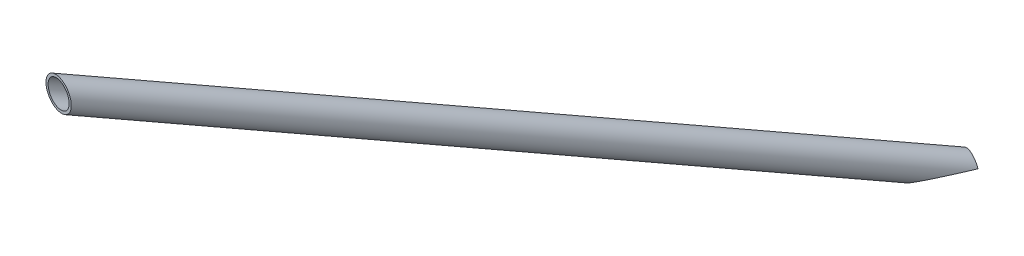
ISO-10303-21;
HEADER;
FILE_DESCRIPTION(('STEP AP214'),'2;1');
FILE_NAME('part.step','',(''),(''),'','','');
FILE_SCHEMA(('AUTOMOTIVE_DESIGN { 1 0 10303 214 1 1 1 1 }'));
ENDSEC;
DATA;
#1=APPLICATION_CONTEXT('core data for automotive mechanical design processes');
#2=APPLICATION_PROTOCOL_DEFINITION('international standard','automotive_design',2000,#1);
#3=PRODUCT_CONTEXT('',#1,'mechanical');
#4=PRODUCT('Part','Part','',(#3));
#5=PRODUCT_RELATED_PRODUCT_CATEGORY('part','',(#4));
#6=PRODUCT_DEFINITION_FORMATION('','',#4);
#7=PRODUCT_DEFINITION_CONTEXT('part definition',#1,'design');
#8=PRODUCT_DEFINITION('design','',#6,#7);
#9=PRODUCT_DEFINITION_SHAPE('','',#8);
#10=(LENGTH_UNIT() NAMED_UNIT(*) SI_UNIT(.MILLI.,.METRE.));
#11=(NAMED_UNIT(*) PLANE_ANGLE_UNIT() SI_UNIT($,.RADIAN.));
#12=(NAMED_UNIT(*) SI_UNIT($,.STERADIAN.) SOLID_ANGLE_UNIT());
#13=UNCERTAINTY_MEASURE_WITH_UNIT(LENGTH_MEASURE(1.E-05),#10,'distance_accuracy_value','');
#14=(GEOMETRIC_REPRESENTATION_CONTEXT(3) GLOBAL_UNCERTAINTY_ASSIGNED_CONTEXT((#13)) GLOBAL_UNIT_ASSIGNED_CONTEXT((#10,
#11,#12)) REPRESENTATION_CONTEXT('',''));
#15=CARTESIAN_POINT('',(0.,0.,0.));
#16=DIRECTION('',(0.,0.,1.));
#17=DIRECTION('',(1.,0.,0.));
#18=AXIS2_PLACEMENT_3D('',#15,#16,#17);
#19=CARTESIAN_POINT('',(324.999999999999,320.,-1580.));
#20=DIRECTION('',(-0.327891874330321,0.357700226542168,0.874378331547523));
#21=DIRECTION('',(0.,-0.925546956205677,0.378632845720504));
#22=AXIS2_PLACEMENT_3D('',#19,#20,#21);
#23=CYLINDRICAL_SURFACE('',#22,7.90000000000002);
#24=CARTESIAN_POINT('',(159.999999999999,500.,-1140.));
#25=DIRECTION('',(-0.133991346812806,-0.0219122293107186,0.990740214781819));
#26=DIRECTION('',(-0.480296136468892,0.8759210569698,-0.0455842434396291));
#27=AXIS2_PLACEMENT_3D('',#24,#25,#26);
#28=ELLIPSE('',#27,8.75464178418664,7.90000000000002);
#29=CARTESIAN_POINT('',(155.795179374886,507.668375084997,-1140.39907372232));
#30=VERTEX_POINT('',#29);
#31=EDGE_CURVE('E165',#30,#30,#28,.T.);
#32=ORIENTED_EDGE('',*,*,#31,.T.);
#33=EDGE_LOOP('',(#32));
#34=FACE_BOUND('',#33,.T.);
#35=CARTESIAN_POINT('',(315.333399629659,323.233561268165,-1551.23119953123));
#36=CARTESIAN_POINT('',(315.257073729415,323.148273269719,-1551.43967338663));
#37=CARTESIAN_POINT('',(315.187469749416,323.065845090942,-1551.65178848201));
#38=CARTESIAN_POINT('',(315.05915631555,322.905889350504,-1552.08114153403));
#39=CARTESIAN_POINT('',(315.00045218952,322.828364197581,-1552.29838193774));
#40=CARTESIAN_POINT('',(314.892017668632,322.677485057099,-1552.73691147005));
#41=CARTESIAN_POINT('',(314.842301940199,322.604138018181,-1552.9582065783));
#42=CARTESIAN_POINT('',(314.750536876463,322.461242155647,-1553.4035999198));
#43=CARTESIAN_POINT('',(314.708488367885,322.391693742187,-1553.62769845255));
#44=CARTESIAN_POINT('',(314.630637430289,322.25543040472,-1554.07995847131));
#45=CARTESIAN_POINT('',(314.594891150018,322.188744601246,-1554.30813830199));
#46=CARTESIAN_POINT('',(314.529208963537,322.058526114918,-1554.76622290089));
#47=CARTESIAN_POINT('',(314.499273238192,321.994993530259,-1554.99612772257));
#48=CARTESIAN_POINT('',(314.417149969425,321.808870735828,-1555.68741096582));
#49=CARTESIAN_POINT('',(314.372562901225,321.690604706342,-1556.15086432664));
#50=CARTESIAN_POINT('',(314.294078588234,321.447560085766,-1557.1499709447));
#51=CARTESIAN_POINT('',(314.262723323637,321.324388188019,-1557.68620369794));
#52=CARTESIAN_POINT('',(314.216875401825,321.09025548236,-1558.76211252635));
#53=CARTESIAN_POINT('',(314.202386054007,320.97929707482,-1559.30178925641));
#54=CARTESIAN_POINT('',(314.18721315969,320.769069827216,-1560.38443376455));
#55=CARTESIAN_POINT('',(314.186550599146,320.669818983572,-1560.92740529429));
#56=CARTESIAN_POINT('',(314.196756879017,320.483471638677,-1562.01525833793));
#57=CARTESIAN_POINT('',(314.207624593172,320.396373951264,-1562.5601396601));
#58=CARTESIAN_POINT('',(314.238951363676,320.23566840067,-1563.64898874411));
#59=CARTESIAN_POINT('',(314.259365077254,320.161999028723,-1564.19294875309));
#60=CARTESIAN_POINT('',(314.308210382497,320.029437251159,-1565.28242125522));
#61=CARTESIAN_POINT('',(314.336643178022,319.970547066771,-1565.82793396929));
#62=CARTESIAN_POINT('',(314.384232599984,319.895683374081,-1566.64672020798));
#63=CARTESIAN_POINT('',(314.400904928735,319.872985919681,-1566.91953274366));
#64=CARTESIAN_POINT('',(314.435737442423,319.832628592903,-1567.4654323012));
#65=CARTESIAN_POINT('',(314.45389757792,319.814968553214,-1567.73851931364));
#66=CARTESIAN_POINT('',(314.491544310667,319.785388225276,-1568.28484233475));
#67=CARTESIAN_POINT('',(314.511030550705,319.773466398255,-1568.55807828378));
#68=CARTESIAN_POINT('',(314.551186630617,319.756255065774,-1569.10466338843));
#69=CARTESIAN_POINT('',(314.571856380081,319.750965054404,-1569.37801253383));
#70=CARTESIAN_POINT('',(314.605089922816,319.748780298929,-1569.80653299383));
#71=CARTESIAN_POINT('',(314.617296036917,319.749245266147,-1569.96171965273));
#72=CARTESIAN_POINT('',(314.642030265,319.752952466413,-1570.27203180401));
#73=CARTESIAN_POINT('',(314.654558377,319.75619468237,-1570.42715729676));
#74=CARTESIAN_POINT('',(314.69260690044,319.770519510729,-1570.89242967658));
#75=CARTESIAN_POINT('',(314.718587567029,319.786200745108,-1571.20242186811));
#76=CARTESIAN_POINT('',(314.771727260507,319.832747222165,-1571.82103611653));
#77=CARTESIAN_POINT('',(314.798885659064,319.86360445699,-1572.1296588095));
#78=CARTESIAN_POINT('',(314.854565077738,319.944380789964,-1572.74429564554));
#79=CARTESIAN_POINT('',(314.883085599862,319.994292967597,-1573.05031069449));
#80=CARTESIAN_POINT('',(314.932664020664,320.098324275195,-1573.56023730321));
#81=CARTESIAN_POINT('',(314.95319207491,320.145994945457,-1573.76550877574));
#82=CARTESIAN_POINT('',(314.995549664248,320.254260554949,-1574.17253854897));
#83=CARTESIAN_POINT('',(315.017379224078,320.314855739882,-1574.37429678279));
#84=CARTESIAN_POINT('',(315.062881924424,320.450654607605,-1574.77218684729));
#85=CARTESIAN_POINT('',(315.086550981441,320.525826457035,-1574.9683298885));
#86=CARTESIAN_POINT('',(315.136642009556,320.692472117497,-1575.35322114003));
#87=CARTESIAN_POINT('',(315.163063112611,320.783940794659,-1575.5419716564));
#88=CARTESIAN_POINT('',(315.214161325062,320.964108538812,-1575.87268678448));
#89=CARTESIAN_POINT('',(315.23812924603,321.049698400456,-1576.01645483535));
#90=CARTESIAN_POINT('',(315.289321510113,321.231943546668,-1576.29617210481));
#91=CARTESIAN_POINT('',(315.316545084521,321.328596218913,-1576.43212315792));
#92=CARTESIAN_POINT('',(315.375046319986,321.532463031361,-1576.69488151943));
#93=CARTESIAN_POINT('',(315.406322854008,321.6396742335,-1576.82169135457));
#94=CARTESIAN_POINT('',(315.473750705151,321.863668205298,-1577.0651651431));
#95=CARTESIAN_POINT('',(315.509902172301,321.980451269493,-1577.18182878404));
#96=CARTESIAN_POINT('',(315.587806654321,322.222052626957,-1577.40425262594));
#97=CARTESIAN_POINT('',(315.629555252255,322.34686454432,-1577.51002130938));
#98=CARTESIAN_POINT('',(315.719327676675,322.602923577115,-1577.71051414741));
#99=CARTESIAN_POINT('',(315.767351664459,322.734170857903,-1577.805238018));
#100=CARTESIAN_POINT('',(315.870245347827,323.00147676745,-1577.98384542197));
#101=CARTESIAN_POINT('',(315.925122143651,323.137540280015,-1578.06771752552));
#102=CARTESIAN_POINT('',(316.042062054397,323.41264372098,-1578.22488407157));
#103=CARTESIAN_POINT('',(316.104125458151,323.551683768824,-1578.29817808866));
#104=CARTESIAN_POINT('',(316.238355718459,323.836833578173,-1578.4374871342));
#105=CARTESIAN_POINT('',(316.310830328364,323.983001301858,-1578.50308619682));
#106=CARTESIAN_POINT('',(316.463970727295,324.275257771128,-1578.62407193832));
#107=CARTESIAN_POINT('',(316.544636597504,324.421346515916,-1578.67945851596));
#108=CARTESIAN_POINT('',(316.714188927779,324.712053614975,-1578.78069554843));
#109=CARTESIAN_POINT('',(316.803075834391,324.856671888899,-1578.82654548482));
#110=CARTESIAN_POINT('',(316.988992338533,325.143207244141,-1578.9093387815));
#111=CARTESIAN_POINT('',(317.08602278581,325.285124041668,-1578.94628121076));
#112=CARTESIAN_POINT('',(317.304564530879,325.588037916547,-1579.01717862324));
#113=CARTESIAN_POINT('',(317.427485914874,325.748365808024,-1579.04966033203));
#114=CARTESIAN_POINT('',(317.683723398088,326.062370254265,-1579.10410867559));
#115=CARTESIAN_POINT('',(317.817040431826,326.216046209117,-1579.12607436377));
#116=CARTESIAN_POINT('',(318.093589306971,326.515477654874,-1579.16014443246));
#117=CARTESIAN_POINT('',(318.236825190735,326.661229872804,-1579.17224476646));
#118=CARTESIAN_POINT('',(318.532509285986,326.943575510939,-1579.18710510524));
#119=CARTESIAN_POINT('',(318.684957656809,327.080168772647,-1579.18986494843));
#120=CARTESIAN_POINT('',(319.009430656764,327.352502188395,-1579.18635936064));
#121=CARTESIAN_POINT('',(319.182076861497,327.487494713233,-1579.17943992451));
#122=CARTESIAN_POINT('',(319.536010638754,327.744700675712,-1579.15580859432));
#123=CARTESIAN_POINT('',(319.717298660164,327.866913448472,-1579.13909619108));
#124=CARTESIAN_POINT('',(320.087337845672,328.097630814885,-1579.09619178025));
#125=CARTESIAN_POINT('',(320.276089412743,328.206134667032,-1579.0699992602));
#126=CARTESIAN_POINT('',(320.659746894475,328.408658661138,-1579.00834931565));
#127=CARTESIAN_POINT('',(320.854652773189,328.502678887675,-1578.97289194528));
#128=CARTESIAN_POINT('',(321.251571811652,328.67667053142,-1578.89234856409));
#129=CARTESIAN_POINT('',(321.453641987048,328.756461191815,-1578.8471528524));
#130=CARTESIAN_POINT('',(321.861094492653,328.900163673781,-1578.74739797568));
#131=CARTESIAN_POINT('',(322.066476880054,328.964075220855,-1578.6928386488));
#132=CARTESIAN_POINT('',(322.478949657557,329.075790370285,-1578.57422378037));
#133=CARTESIAN_POINT('',(322.686040557778,329.123588969188,-1578.51016529799));
#134=CARTESIAN_POINT('',(323.100083582474,329.203011337947,-1578.37231188298));
#135=CARTESIAN_POINT('',(323.307035709029,329.234635356115,-1578.29851709984));
#136=CARTESIAN_POINT('',(323.718300473238,329.28183089765,-1578.14100636718));
#137=CARTESIAN_POINT('',(323.922618993184,329.297448358217,-1578.05731958205));
#138=CARTESIAN_POINT('',(324.327187569259,329.313235645685,-1577.87926876631));
#139=CARTESIAN_POINT('',(324.527437369643,329.313404504536,-1577.78490406695));
#140=CARTESIAN_POINT('',(324.92150250627,329.299047371433,-1577.58480279137));
#141=CARTESIAN_POINT('',(325.115321347712,329.284529525026,-1577.47907254776));
#142=CARTESIAN_POINT('',(325.494150486922,329.241930250984,-1577.25530033875));
#143=CARTESIAN_POINT('',(325.679162823843,329.213851980225,-1577.13726124386));
#144=CARTESIAN_POINT('',(326.001527993344,329.15259945673,-1576.91304453833));
#145=CARTESIAN_POINT('',(326.140971403658,329.121592631405,-1576.80927067966));
#146=CARTESIAN_POINT('',(326.411034511029,329.053015677123,-1576.592809413));
#147=CARTESIAN_POINT('',(326.541656003214,329.015446889043,-1576.48012382861));
#148=CARTESIAN_POINT('',(326.79240940805,328.935089610816,-1576.24567000731));
#149=CARTESIAN_POINT('',(326.912555766996,328.892308510777,-1576.12391472266));
#150=CARTESIAN_POINT('',(327.141125772871,328.802995328787,-1575.87110678148));
#151=CARTESIAN_POINT('',(327.249549460768,328.756463259945,-1575.74005415744));
#152=CARTESIAN_POINT('',(327.453912019129,328.66109993689,-1575.46831687298));
#153=CARTESIAN_POINT('',(327.549792273862,328.612259245324,-1575.32759137254));
#154=CARTESIAN_POINT('',(327.727648554392,328.514197034955,-1575.03774888265));
#155=CARTESIAN_POINT('',(327.809625242924,328.464975534422,-1574.88863229363));
#156=CARTESIAN_POINT('',(327.959389427466,328.36773041001,-1574.5830944793));
#157=CARTESIAN_POINT('',(328.027178159841,328.319706682077,-1574.42667389193));
#158=CARTESIAN_POINT('',(328.14889584171,328.226118298673,-1574.10783155977));
#159=CARTESIAN_POINT('',(328.202822887309,328.180553981679,-1573.9454089941));
#160=CARTESIAN_POINT('',(328.310765006895,328.08061229446,-1573.57028635803));
#161=CARTESIAN_POINT('',(328.360666986427,328.027289653037,-1573.35612155335));
#162=CARTESIAN_POINT('',(328.441679071189,327.927011771403,-1572.92282795217));
#163=CARTESIAN_POINT('',(328.472781650755,327.880059087001,-1572.7036972041));
#164=CARTESIAN_POINT('',(328.519062183059,327.792446471794,-1572.26174250907));
#165=CARTESIAN_POINT('',(328.534181533538,327.751810160952,-1572.03890799314));
#166=CARTESIAN_POINT('',(328.550949973658,327.676624334175,-1571.59180834146));
#167=CARTESIAN_POINT('',(328.55260098117,327.642073952298,-1571.36754341395));
#168=CARTESIAN_POINT('',(328.543161775061,327.565444521448,-1570.8271552078));
#169=CARTESIAN_POINT('',(328.526617665066,327.526016842239,-1570.51076094843));
#170=CARTESIAN_POINT('',(328.476502084754,327.455877180446,-1569.87829131873));
#171=CARTESIAN_POINT('',(328.442920609763,327.42517033545,-1569.56221624524));
#172=CARTESIAN_POINT('',(328.362244430466,327.370597277898,-1568.93056955384));
#173=CARTESIAN_POINT('',(328.315121543915,327.346745541361,-1568.6150003806));
#174=CARTESIAN_POINT('',(328.209986430016,327.304415597538,-1567.98542132492));
#175=CARTESIAN_POINT('',(328.151976453993,327.285936281307,-1567.67141113385));
#176=CARTESIAN_POINT('',(328.026600732711,327.252994018529,-1567.0435547772));
#177=CARTESIAN_POINT('',(327.959192906953,327.23855006716,-1566.72971610484));
#178=CARTESIAN_POINT('',(327.816543024254,327.212743724293,-1566.103695831));
#179=CARTESIAN_POINT('',(327.741300639828,327.20138146168,-1565.79151429936));
#180=CARTESIAN_POINT('',(327.584014749459,327.180894221997,-1565.16919338736));
#181=CARTESIAN_POINT('',(327.501979349579,327.171766628361,-1564.85905203644));
#182=CARTESIAN_POINT('',(327.331688295647,327.155027439229,-1564.24045483012));
#183=CARTESIAN_POINT('',(327.243432765068,327.147415813652,-1563.93199894139));
#184=CARTESIAN_POINT('',(326.99117496315,327.127604504525,-1563.08048730944));
#185=CARTESIAN_POINT('',(326.821059078883,327.116371264573,-1562.53921217426));
#186=CARTESIAN_POINT('',(326.46422828244,327.094011965552,-1561.46202412007));
#187=CARTESIAN_POINT('',(326.277509089958,327.082885934945,-1560.92611262363));
#188=CARTESIAN_POINT('',(325.888426811652,327.058492071239,-1559.8620081517));
#189=CARTESIAN_POINT('',(325.686116366095,327.045231293581,-1559.33379579551));
#190=CARTESIAN_POINT('',(325.264799354932,327.014392158272,-1558.28427964126));
#191=CARTESIAN_POINT('',(325.045795692647,326.996814550237,-1557.7629746603));
#192=CARTESIAN_POINT('',(324.605518763814,326.95649729636,-1556.7647017511));
#193=CARTESIAN_POINT('',(324.385469171687,326.934203196319,-1556.28717741088));
#194=CARTESIAN_POINT('',(323.927533651287,326.881680840137,-1555.34086841298));
#195=CARTESIAN_POINT('',(323.689640691448,326.851449444273,-1554.87208729258));
#196=CARTESIAN_POINT('',(323.316754936426,326.797903545714,-1554.17729623277));
#197=CARTESIAN_POINT('',(323.189586019828,326.778654004289,-1553.94676249703));
#198=CARTESIAN_POINT('',(322.929410183879,326.736928171583,-1553.48931837145));
#199=CARTESIAN_POINT('',(322.796403729258,326.714452136843,-1553.26240769514));
#200=CARTESIAN_POINT('',(322.523948885639,326.665699118312,-1552.81312076292));
#201=CARTESIAN_POINT('',(322.384505376427,326.639424982586,-1552.59074125056));
#202=CARTESIAN_POINT('',(322.098210237908,326.582312431303,-1552.15142879069));
#203=CARTESIAN_POINT('',(321.951359859654,326.551474784854,-1551.93449493258));
#204=CARTESIAN_POINT('',(321.647808883648,326.483966236814,-1551.50573618297));
#205=CARTESIAN_POINT('',(321.491035879064,326.447248492524,-1551.29396954536));
#206=CARTESIAN_POINT('',(321.167100608109,326.36677939762,-1550.87956588222));
#207=CARTESIAN_POINT('',(320.999930478154,326.323022682596,-1550.6769359718));
#208=CARTESIAN_POINT('',(320.654234942745,326.226869548822,-1550.28557616519));
#209=CARTESIAN_POINT('',(320.475773589288,326.174519575989,-1550.09677903236));
#210=CARTESIAN_POINT('',(320.104516207801,326.058488459959,-1549.73791585332));
#211=CARTESIAN_POINT('',(319.911748037461,325.994829017736,-1549.56781492654));
#212=CARTESIAN_POINT('',(319.545401020504,325.865360291695,-1549.28406226055));
#213=CARTESIAN_POINT('',(319.374616927315,325.802002114376,-1549.16576123788));
#214=CARTESIAN_POINT('',(319.021127912412,325.662875002766,-1548.95758140531));
#215=CARTESIAN_POINT('',(318.838460887269,325.587144460644,-1548.86761711646));
#216=CARTESIAN_POINT('',(318.527831520821,325.449953295488,-1548.75285164234));
#217=CARTESIAN_POINT('',(318.402524084776,325.392469274363,-1548.71628733928));
#218=CARTESIAN_POINT('',(318.15016178168,325.271671794418,-1548.6653952922));
#219=CARTESIAN_POINT('',(318.023109027817,325.208364933385,-1548.65104270132));
#220=CARTESIAN_POINT('',(317.770059010132,325.07669083465,-1548.64766497653));
#221=CARTESIAN_POINT('',(317.644075158304,325.008291575155,-1548.65881601266));
#222=CARTESIAN_POINT('',(317.398584987458,324.869113339534,-1548.70713787616));
#223=CARTESIAN_POINT('',(317.27907977373,324.798333960664,-1548.74431312844));
#224=CARTESIAN_POINT('',(317.059570016809,324.662785421352,-1548.83761534736));
#225=CARTESIAN_POINT('',(316.958770320407,324.598007006856,-1548.89190452136));
#226=CARTESIAN_POINT('',(316.766538916283,324.469865077407,-1549.01629313106));
#227=CARTESIAN_POINT('',(316.675113049884,324.406502463715,-1549.086402339));
#228=CARTESIAN_POINT('',(316.436668552616,324.23537910083,-1549.29593483665));
#229=CARTESIAN_POINT('',(316.299205978556,324.129851682213,-1549.44798467611));
#230=CARTESIAN_POINT('',(316.048375878168,323.926430673207,-1549.77523956009));
#231=CARTESIAN_POINT('',(315.935089328127,323.828563412205,-1549.95051933054));
#232=CARTESIAN_POINT('',(315.733217304438,323.644849419235,-1550.30601414016));
#233=CARTESIAN_POINT('',(315.643654738108,323.558642401158,-1550.4855004448));
#234=CARTESIAN_POINT('',(315.519888926463,323.433639953208,-1550.76101141359));
#235=CARTESIAN_POINT('',(315.480429560681,323.392727785054,-1550.85380302655));
#236=CARTESIAN_POINT('',(315.404644441376,323.312198008323,-1551.04120893935));
#237=CARTESIAN_POINT('',(315.368318571889,323.272580351872,-1551.13582317158));
#238=CARTESIAN_POINT('',(315.333399629659,323.233561268165,-1551.23119953123));
#239=B_SPLINE_CURVE_WITH_KNOTS('',3,(#35,#36,#37,#38,#39,#40,#41,#42,#43,#44,#45,#46,#47,#48,
#49,#50,#51,#52,#53,#54,#55,#56,#57,#58,#59,#60,#61,#62,#63,#64,#65,#66,#67,#68,#69,#70,#71,#72,
#73,#74,#75,#76,#77,#78,#79,#80,#81,#82,#83,#84,#85,#86,#87,#88,#89,#90,#91,#92,#93,#94,#95,#96,
#97,#98,#99,#100,#101,#102,#103,#104,#105,#106,#107,#108,#109,#110,#111,#112,#113,#114,#115,
#116,#117,#118,#119,#120,#121,#122,#123,#124,#125,#126,#127,#128,#129,#130,#131,#132,#133,#134,
#135,#136,#137,#138,#139,#140,#141,#142,#143,#144,#145,#146,#147,#148,#149,#150,#151,#152,#153,
#154,#155,#156,#157,#158,#159,#160,#161,#162,#163,#164,#165,#166,#167,#168,#169,#170,#171,#172,
#173,#174,#175,#176,#177,#178,#179,#180,#181,#182,#183,#184,#185,#186,#187,#188,#189,#190,#191,
#192,#193,#194,#195,#196,#197,#198,#199,#200,#201,#202,#203,#204,#205,#206,#207,#208,#209,#210,
#211,#212,#213,#214,#215,#216,#217,#218,#219,#220,#221,#222,#223,#224,#225,#226,#227,#228,#229,
#230,#231,#232,#233,#234,#235,#236,#237,#238),.UNSPECIFIED.,.T.,.F.,(4,2,2,2,2,2,2,2,2,2,2,2,2,
2,2,2,2,2,2,2,2,2,2,2,2,2,2,2,2,2,2,2,2,2,2,2,2,2,2,2,2,2,2,2,2,2,2,2,2,2,2,2,2,2,2,2,2,2,2,2,2,
2,2,2,2,2,2,2,2,2,2,2,2,2,2,2,2,2,2,2,2,2,2,2,2,2,2,2,2,2,2,2,2,2,2,2,2,2,2,2,2,4),(0.,
0.713420110377601,1.42718802709981,2.14211029417271,2.85710960292213,3.57818836409352,
4.29928956650726,5.7398898955553,7.39268766947131,9.04580969751866,10.7014406110207,
12.3569098197136,14.0045943277715,15.6525263252516,16.4752735516733,17.297993448457,
18.1204925995699,18.9429290021858,19.4099059014832,19.8768799268631,20.8109801384383,
21.7445879854375,22.6778570797709,23.3127065989808,23.9475681881747,24.581058634611,
25.2143498689083,25.7209008573272,26.2273324768726,26.7336235705175,27.2399302491112,
27.7458397057157,28.2517621685074,28.758213239268,29.2646846715652,29.7917044466115,
30.3187294454235,30.8457830877836,31.3728917947391,31.986087325396,32.599338043042,
33.2128401745269,33.826352919992,34.4833793559779,35.1404399575637,35.7975360838652,
36.4546283728671,37.1195506207916,37.7844843622107,38.4496243915476,39.1147542093404,
39.7779697811159,40.4412269117233,41.1041163879418,41.7668516173661,42.2960236476305,
42.8250876727776,43.3534101249934,43.8817307308502,44.4124381380349,44.9431202411134,
45.4737560803265,46.0044647631929,46.6821745849613,47.3601555240772,48.0406137383532,
48.7209750547279,49.6779889350757,50.6355654442319,51.5951494667973,52.5545352766529,
53.5183637869996,54.4822326014726,55.444967369391,56.4076830319211,58.1098392203286,
59.8124355011927,61.5095159812593,63.2063019720416,64.7847421538638,66.3638076557243,
67.1556775504814,67.9474845178014,68.7387007872788,69.5297838614276,70.3275148999406,
71.1258567958955,71.9200178007486,72.7126710866365,73.3625971727757,74.0105435251874,
74.4369066054954,74.8627923947016,75.2916289299525,75.7205383981942,76.1136999250851,
76.507104981141,77.194710647809,77.8845844688454,78.5386401579653,78.865040474352,
79.1914287061348),.UNSPECIFIED.);
#240=CARTESIAN_POINT('',(325.871823061562,329.177231309269,-1577.00323914385));
#241=VERTEX_POINT('',#240);
#242=CARTESIAN_POINT('',(314.51800675531,319.770985762674,-1568.65187457882));
#243=VERTEX_POINT('',#242);
#244=EDGE_CURVE('E151',#241,#243,#239,.T.);
#245=ORIENTED_EDGE('',*,*,#244,.T.);
#246=CARTESIAN_POINT('',(318.639741179461,319.626643213835,-1560.04811033071));
#247=CARTESIAN_POINT('',(318.537194238363,319.614661888643,-1560.07739762781));
#248=CARTESIAN_POINT('',(318.435921922965,319.603152562491,-1560.11131770603));
#249=CARTESIAN_POINT('',(318.236708011359,319.581164593803,-1560.18812219254));
#250=CARTESIAN_POINT('',(318.138767388307,319.570686250744,-1560.23100919428));
#251=CARTESIAN_POINT('',(317.851012177583,319.540901953868,-1560.37242582653));
#252=CARTESIAN_POINT('',(317.66717784962,319.523236656087,-1560.48373610413));
#253=CARTESIAN_POINT('',(317.281923619822,319.489162313834,-1560.76127486041));
#254=CARTESIAN_POINT('',(317.08528414405,319.473849090427,-1560.93417259197));
#255=CARTESIAN_POINT('',(316.721978079521,319.44945273475,-1561.30942041513));
#256=CARTESIAN_POINT('',(316.555371249114,319.440381924678,-1561.51182780881));
#257=CARTESIAN_POINT('',(316.282115534402,319.429032628664,-1561.89138655651));
#258=CARTESIAN_POINT('',(316.170236219322,319.425723894647,-1562.0648370674));
#259=CARTESIAN_POINT('',(315.961741853425,319.422112841622,-1562.4207965586));
#260=CARTESIAN_POINT('',(315.865136387684,319.421812403151,-1562.6033111334));
#261=CARTESIAN_POINT('',(315.685376594379,319.423904932374,-1562.97510358573));
#262=CARTESIAN_POINT('',(315.602243135349,319.426302033863,-1563.1643914119));
#263=CARTESIAN_POINT('',(315.447957070969,319.433544518869,-1563.54778707451));
#264=CARTESIAN_POINT('',(315.376809160612,319.438390858845,-1563.74189676576));
#265=CARTESIAN_POINT('',(315.246788463818,319.450193056003,-1564.12868294056));
#266=CARTESIAN_POINT('',(315.18765282172,319.457093026177,-1564.32127351278));
#267=CARTESIAN_POINT('',(315.078383266117,319.472918984871,-1564.70892444081));
#268=CARTESIAN_POINT('',(315.028251150133,319.481845377154,-1564.90398528148));
#269=CARTESIAN_POINT('',(314.889876265709,319.511547429799,-1565.49212796486));
#270=CARTESIAN_POINT('',(314.813731137777,319.535238601771,-1565.88793446538));
#271=CARTESIAN_POINT('',(314.687717730392,319.590267608165,-1566.68444177892));
#272=CARTESIAN_POINT('',(314.637944004311,319.621632376376,-1567.08515500272));
#273=CARTESIAN_POINT('',(314.560945382577,319.692295009788,-1567.88784004513));
#274=CARTESIAN_POINT('',(314.533710659633,319.731589408265,-1568.28981123844));
#275=CARTESIAN_POINT('',(314.505172870245,319.803007055922,-1568.94640561811));
#276=CARTESIAN_POINT('',(314.498026203157,319.832488093272,-1569.20109041149));
#277=CARTESIAN_POINT('',(314.491010032953,319.895372427655,-1569.71009194139));
#278=CARTESIAN_POINT('',(314.491140811577,319.928775876489,-1569.96440866327));
#279=CARTESIAN_POINT('',(314.498212862872,320.000015594843,-1570.47253210721));
#280=CARTESIAN_POINT('',(314.505159627074,320.03785541703,-1570.72633825267));
#281=CARTESIAN_POINT('',(314.525509976205,320.118591288934,-1571.23288041931));
#282=CARTESIAN_POINT('',(314.538913353227,320.161487175809,-1571.48561647468));
#283=CARTESIAN_POINT('',(314.571849256681,320.25299600699,-1571.98858649337));
#284=CARTESIAN_POINT('',(314.591356552373,320.301584910967,-1572.23882645813));
#285=CARTESIAN_POINT('',(314.636368708384,320.405719053536,-1572.73735439092));
#286=CARTESIAN_POINT('',(314.661874233976,320.461265063432,-1572.98564213928));
#287=CARTESIAN_POINT('',(314.718815626145,320.580662209761,-1573.47920942153));
#288=CARTESIAN_POINT('',(314.750243996978,320.644502817468,-1573.72449234484));
#289=CARTESIAN_POINT('',(314.819161008417,320.782371056132,-1574.21128012106));
#290=CARTESIAN_POINT('',(314.856647697189,320.856395405014,-1574.4527861634));
#291=CARTESIAN_POINT('',(314.92691830386,320.99512835984,-1574.86541636023));
#292=CARTESIAN_POINT('',(314.958200545547,321.056879602546,-1575.03778795796));
#293=CARTESIAN_POINT('',(315.024356506575,321.188148957321,-1575.37888476594));
#294=CARTESIAN_POINT('',(315.059230376518,321.257667395089,-1575.54760982293));
#295=CARTESIAN_POINT('',(315.132830624894,321.405639522868,-1575.88010221415));
#296=CARTESIAN_POINT('',(315.171553949711,321.484086137567,-1576.04387334571));
#297=CARTESIAN_POINT('',(315.253263505029,321.651245602431,-1576.36501843513));
#298=CARTESIAN_POINT('',(315.29624903794,321.739956773002,-1576.52239343391));
#299=CARTESIAN_POINT('',(315.37969614769,321.913669497961,-1576.80416103285));
#300=CARTESIAN_POINT('',(315.419457366671,321.996985321431,-1576.92979618723));
#301=CARTESIAN_POINT('',(315.502652136911,322.172143256745,-1577.17367440063));
#302=CARTESIAN_POINT('',(315.546084542884,322.26398271037,-1577.29191974516));
#303=CARTESIAN_POINT('',(315.636901207434,322.456181217641,-1577.51931924394));
#304=CARTESIAN_POINT('',(315.684278808178,322.55652592291,-1577.62848811716));
#305=CARTESIAN_POINT('',(315.783375071465,322.765500115704,-1577.83645713973));
#306=CARTESIAN_POINT('',(315.835093565965,322.874129282506,-1577.93525769012));
#307=CARTESIAN_POINT('',(315.943450843538,323.099372014506,-1578.12178650404));
#308=CARTESIAN_POINT('',(316.000114806863,323.21602571333,-1578.20945176536));
#309=CARTESIAN_POINT('',(316.118345821895,323.455371529021,-1578.37234180071));
#310=CARTESIAN_POINT('',(316.179912963329,323.578063756376,-1578.44756634699));
#311=CARTESIAN_POINT('',(316.308227776469,323.827997785337,-1578.58555038172));
#312=CARTESIAN_POINT('',(316.374984477491,323.955247298967,-1578.64828743621));
#313=CARTESIAN_POINT('',(316.513700752164,324.212317616589,-1578.7615272366));
#314=CARTESIAN_POINT('',(316.585661047167,324.342138775258,-1578.81202828203));
#315=CARTESIAN_POINT('',(316.748573974403,324.626618901447,-1578.90978588367));
#316=CARTESIAN_POINT('',(316.840587305078,324.781460148521,-1578.95474269107));
#317=CARTESIAN_POINT('',(317.032100960754,325.090015377409,-1579.03021186331));
#318=CARTESIAN_POINT('',(317.13160289971,325.24372910834,-1579.06072110401));
#319=CARTESIAN_POINT('',(317.338203523439,325.548194165424,-1579.10901919006));
#320=CARTESIAN_POINT('',(317.445309020033,325.698942676725,-1579.12679646702));
#321=CARTESIAN_POINT('',(317.667000330751,325.995733828425,-1579.15118482654));
#322=CARTESIAN_POINT('',(317.781585817211,326.141776674539,-1579.15779639788));
#323=CARTESIAN_POINT('',(318.020687560816,326.430921766438,-1579.16130758681));
#324=CARTESIAN_POINT('',(318.145364065053,326.573893827675,-1579.15799593438));
#325=CARTESIAN_POINT('',(318.402253146989,326.852379485085,-1579.14249633023));
#326=CARTESIAN_POINT('',(318.534465686488,326.987893119058,-1579.1303084235));
#327=CARTESIAN_POINT('',(318.806136294568,327.250396673726,-1579.0981612791));
#328=CARTESIAN_POINT('',(318.94559245781,327.377388815948,-1579.07820407617));
#329=CARTESIAN_POINT('',(319.231438008303,327.621968108588,-1579.03145555058));
#330=CARTESIAN_POINT('',(319.377827755103,327.739554770425,-1579.00466387321));
#331=CARTESIAN_POINT('',(319.702492553095,327.983560249042,-1578.93999800164));
#332=CARTESIAN_POINT('',(319.881966384887,328.108097884032,-1578.90101505645));
#333=CARTESIAN_POINT('',(320.248973833528,328.341962755326,-1578.81591730273));
#334=CARTESIAN_POINT('',(320.436508263353,328.451288452651,-1578.76980177358));
#335=CARTESIAN_POINT('',(320.818680047178,328.653695670976,-1578.67138748321));
#336=CARTESIAN_POINT('',(321.013319707915,328.746771858777,-1578.61908670135));
#337=CARTESIAN_POINT('',(321.408469879177,328.915723131755,-1578.50916610547));
#338=CARTESIAN_POINT('',(321.608980198553,328.991598776283,-1578.4515464645));
#339=CARTESIAN_POINT('',(322.01409425198,329.125255642645,-1578.33188286387));
#340=CARTESIAN_POINT('',(322.218687206543,329.183079152702,-1578.26984966863));
#341=CARTESIAN_POINT('',(322.631013162273,329.280325030073,-1578.14190384107));
#342=CARTESIAN_POINT('',(322.838746185346,329.319747268953,-1578.07599118168));
#343=CARTESIAN_POINT('',(323.255810636137,329.379834427257,-1577.94088188254));
#344=CARTESIAN_POINT('',(323.465141783781,329.400502560585,-1577.87168580761));
#345=CARTESIAN_POINT('',(323.883869915437,329.422950637223,-1577.73049587008));
#346=CARTESIAN_POINT('',(324.093266898356,329.424730879227,-1577.65850205174));
#347=CARTESIAN_POINT('',(324.50612759987,329.409633844774,-1577.51365856043));
#348=CARTESIAN_POINT('',(324.709623368213,329.393148913805,-1577.4408588862));
#349=CARTESIAN_POINT('',(325.113635114264,329.34240072923,-1577.29323056855));
#350=CARTESIAN_POINT('',(325.314151131717,329.308137712978,-1577.21840195223));
#351=CARTESIAN_POINT('',(325.710727015342,329.22226121975,-1577.06685762016));
#352=CARTESIAN_POINT('',(325.906786381718,329.170645806921,-1576.99014169474));
#353=CARTESIAN_POINT('',(326.292945995863,329.050664096874,-1576.83484090247));
#354=CARTESIAN_POINT('',(326.483046192389,328.982297655654,-1576.75625601955));
#355=CARTESIAN_POINT('',(326.858509564279,328.828465664416,-1576.59591689987));
#356=CARTESIAN_POINT('',(327.043765176068,328.742768165508,-1576.51413332587));
#357=CARTESIAN_POINT('',(327.405130022032,328.555843622441,-1576.3481140096));
#358=CARTESIAN_POINT('',(327.581238752902,328.454615724938,-1576.26387813278));
#359=CARTESIAN_POINT('',(327.922813610713,328.237699359919,-1576.09231852484));
#360=CARTESIAN_POINT('',(328.088276302845,328.122006260475,-1576.00499381108));
#361=CARTESIAN_POINT('',(328.406879344442,327.877476602104,-1575.82638474256));
#362=CARTESIAN_POINT('',(328.560021371868,327.748641838389,-1575.73510092961));
#363=CARTESIAN_POINT('',(328.831374561498,327.498612726366,-1575.56074773129));
#364=CARTESIAN_POINT('',(328.951450231106,327.378957058935,-1575.47836833509));
#365=CARTESIAN_POINT('',(329.180087164941,327.132293437752,-1575.30878642288));
#366=CARTESIAN_POINT('',(329.288650164163,327.005286596316,-1575.22158463664));
#367=CARTESIAN_POINT('',(329.492830493906,326.745509614336,-1575.04128504694));
#368=CARTESIAN_POINT('',(329.588464297167,326.612747097433,-1574.94819497197));
#369=CARTESIAN_POINT('',(329.765513842336,326.343111614805,-1574.75472083419));
#370=CARTESIAN_POINT('',(329.846933349332,326.206239748858,-1574.65433871289));
#371=CARTESIAN_POINT('',(329.978472486874,325.959931179817,-1574.46725535698));
#372=CARTESIAN_POINT('',(330.031566740162,325.850845137759,-1574.38217982631));
#373=CARTESIAN_POINT('',(330.127399897613,325.632835251815,-1574.206208625));
#374=CARTESIAN_POINT('',(330.170141517073,325.523911372861,-1574.11531448839));
#375=CARTESIAN_POINT('',(330.244728591121,325.307807063698,-1573.92752260597));
#376=CARTESIAN_POINT('',(330.276590493728,325.200624237124,-1573.83063418665));
#377=CARTESIAN_POINT('',(330.329270090657,324.989304035478,-1573.63071453221));
#378=CARTESIAN_POINT('',(330.350087860851,324.885166639488,-1573.52768333929));
#379=CARTESIAN_POINT('',(330.380805112449,324.681151575612,-1573.31565644338));
#380=CARTESIAN_POINT('',(330.390689442463,324.58128000291,-1573.20665268254));
#381=CARTESIAN_POINT('',(330.399964279233,324.387028614998,-1572.98344741396));
#382=CARTESIAN_POINT('',(330.399354749086,324.292648819103,-1572.86924588795));
#383=CARTESIAN_POINT('',(330.388424892615,324.109970450064,-1572.63636503939));
#384=CARTESIAN_POINT('',(330.378094856016,324.021678052579,-1572.51768135321));
#385=CARTESIAN_POINT('',(330.348691825858,323.85151608501,-1572.27682345065));
#386=CARTESIAN_POINT('',(330.329615772583,323.769648774433,-1572.15464802676));
#387=CARTESIAN_POINT('',(330.271612969902,323.570561418098,-1571.8422293817));
#388=CARTESIAN_POINT('',(330.22752379356,323.457597973009,-1571.6502257478));
#389=CARTESIAN_POINT('',(330.12482777377,323.245176700666,-1571.26267150296));
#390=CARTESIAN_POINT('',(330.066211279441,323.145727919837,-1571.06711861452));
#391=CARTESIAN_POINT('',(329.937062108838,322.958070285677,-1570.67362388276));
#392=CARTESIAN_POINT('',(329.866484050633,322.86990657141,-1570.47567571197));
#393=CARTESIAN_POINT('',(329.715724827063,322.703327039465,-1570.07944754886));
#394=CARTESIAN_POINT('',(329.635545369973,322.624909492799,-1569.88116762175));
#395=CARTESIAN_POINT('',(329.457459769781,322.467532826106,-1569.46241254044));
#396=CARTESIAN_POINT('',(329.358575064483,322.389538958554,-1569.2419944515));
#397=CARTESIAN_POINT('',(329.152189773491,322.241448294812,-1568.80250919422));
#398=CARTESIAN_POINT('',(329.044686997394,322.171353517247,-1568.58344238465));
#399=CARTESIAN_POINT('',(328.821910069443,322.037427112962,-1568.14706219775));
#400=CARTESIAN_POINT('',(328.706627860055,321.973602153519,-1567.92975090777));
#401=CARTESIAN_POINT('',(328.469000966028,321.85105106761,-1567.49760215507));
#402=CARTESIAN_POINT('',(328.346656844685,321.792324535398,-1567.28276449668));
#403=CARTESIAN_POINT('',(328.095149187564,321.678932702524,-1566.85580099047));
#404=CARTESIAN_POINT('',(327.965980477163,321.624270561457,-1566.64367735638));
#405=CARTESIAN_POINT('',(327.70107683624,321.518271697462,-1566.22273206523));
#406=CARTESIAN_POINT('',(327.5653419995,321.466934927063,-1566.01391036105));
#407=CARTESIAN_POINT('',(327.28742617236,321.366991338258,-1565.60016308227));
#408=CARTESIAN_POINT('',(327.145249959591,321.318382554501,-1565.39523477497));
#409=CARTESIAN_POINT('',(326.854261851136,321.223345791565,-1564.98962727489));
#410=CARTESIAN_POINT('',(326.705449904411,321.176917829166,-1564.7889481148));
#411=CARTESIAN_POINT('',(326.347314962378,321.069761232506,-1564.32251918401));
#412=CARTESIAN_POINT('',(326.13515362717,321.00976098697,-1564.05876936702));
#413=CARTESIAN_POINT('',(325.697574230603,320.892154689078,-1563.5419863425));
#414=CARTESIAN_POINT('',(325.472158367558,320.83454824239,-1563.28895136979));
#415=CARTESIAN_POINT('',(325.007347877658,320.721177176543,-1562.79648361684));
#416=CARTESIAN_POINT('',(324.767980027583,320.665409331271,-1562.55702641497));
#417=CARTESIAN_POINT('',(324.273509169165,320.555118262388,-1562.09467925178));
#418=CARTESIAN_POINT('',(324.018413563583,320.500594469534,-1561.87178160349));
#419=CARTESIAN_POINT('',(323.59803693986,320.41442759251,-1561.53376719709));
#420=CARTESIAN_POINT('',(323.438412129917,320.382495554418,-1561.4116779024));
#421=CARTESIAN_POINT('',(323.112626149219,320.318904163112,-1561.17651133781));
#422=CARTESIAN_POINT('',(322.946466620951,320.287244743782,-1561.06343182467));
#423=CARTESIAN_POINT('',(322.607302941272,320.224196187828,-1560.84809384549));
#424=CARTESIAN_POINT('',(322.4343024578,320.192806917061,-1560.74582968579));
#425=CARTESIAN_POINT('',(322.081193647359,320.130334012352,-1560.55440141125));
#426=CARTESIAN_POINT('',(321.90108791246,320.099250272024,-1560.46523257415));
#427=CARTESIAN_POINT('',(321.463751386343,320.025726723376,-1560.27190207286));
#428=CARTESIAN_POINT('',(321.203226701976,319.983461406971,-1560.17492473089));
#429=CARTESIAN_POINT('',(320.66990543886,319.900330952583,-1560.02131856188));
#430=CARTESIAN_POINT('',(320.397122590086,319.859464334132,-1559.9646457324));
#431=CARTESIAN_POINT('',(319.997561228968,319.802284573126,-1559.92029664844));
#432=CARTESIAN_POINT('',(319.873141539411,319.784848295621,-1559.91180962953));
#433=CARTESIAN_POINT('',(319.623977222965,319.750705520008,-1559.90631728091));
#434=CARTESIAN_POINT('',(319.499232842966,319.733998579689,-1559.90930489329));
#435=CARTESIAN_POINT('',(319.250694958859,319.701522622245,-1559.92754290695));
#436=CARTESIAN_POINT('',(319.126900309783,319.68575223686,-1559.94277492161));
#437=CARTESIAN_POINT('',(318.881403003535,319.655320471725,-1559.98592970054));
#438=CARTESIAN_POINT('',(318.759699981045,319.640658896761,-1560.0138502248));
#439=CARTESIAN_POINT('',(318.639741179461,319.626643213835,-1560.04811033071));
#440=B_SPLINE_CURVE_WITH_KNOTS('',3,(#246,#247,#248,#249,#250,#251,#252,#253,#254,#255,#256,
#257,#258,#259,#260,#261,#262,#263,#264,#265,#266,#267,#268,#269,#270,#271,#272,#273,#274,#275,
#276,#277,#278,#279,#280,#281,#282,#283,#284,#285,#286,#287,#288,#289,#290,#291,#292,#293,#294,
#295,#296,#297,#298,#299,#300,#301,#302,#303,#304,#305,#306,#307,#308,#309,#310,#311,#312,#313,
#314,#315,#316,#317,#318,#319,#320,#321,#322,#323,#324,#325,#326,#327,#328,#329,#330,#331,#332,
#333,#334,#335,#336,#337,#338,#339,#340,#341,#342,#343,#344,#345,#346,#347,#348,#349,#350,#351,
#352,#353,#354,#355,#356,#357,#358,#359,#360,#361,#362,#363,#364,#365,#366,#367,#368,#369,#370,
#371,#372,#373,#374,#375,#376,#377,#378,#379,#380,#381,#382,#383,#384,#385,#386,#387,#388,#389,
#390,#391,#392,#393,#394,#395,#396,#397,#398,#399,#400,#401,#402,#403,#404,#405,#406,#407,#408,
#409,#410,#411,#412,#413,#414,#415,#416,#417,#418,#419,#420,#421,#422,#423,#424,#425,#426,#427,
#428,#429,#430,#431,#432,#433,#434,#435,#436,#437,#438,#439),.UNSPECIFIED.,.T.,.F.,(4,2,2,2,2,2,
2,2,2,2,2,2,2,2,2,2,2,2,2,2,2,2,2,2,2,2,2,2,2,2,2,2,2,2,2,2,2,2,2,2,2,2,2,2,2,2,2,2,2,2,2,2,2,2,
2,2,2,2,2,2,2,2,2,2,2,2,2,2,2,2,2,2,2,2,2,2,2,2,2,2,2,2,2,2,2,2,2,2,2,2,2,2,2,2,2,2,4),(0.,
0.32182476487474,0.643742738499033,1.28731105936755,2.06991028254614,2.85404991853869,
3.47249536333916,4.09132738503394,4.71110901740693,5.33113286972155,5.9356244626748,
6.54023660635459,7.75020119037428,8.96447517740806,10.178219446278,10.9475573022342,
11.7169249424728,12.4869129592616,13.2568761835732,14.0236978725488,14.7906046510142,
15.55654729897,16.3222436702211,16.8793091866038,17.4363980709329,17.9930485132618,
18.5496079990869,19.0169318241983,19.4841103941955,19.9505159485071,20.4169034557055,
20.8858221629575,21.3547494533431,21.8245117218021,22.2943392366388,22.8504642268397,
23.406709418997,23.9634593826971,24.5201849741057,25.0888471273253,25.6575063980955,
26.2260168405065,26.7945567959113,27.4594631352012,28.1244366936755,28.7896280923692,
29.4547978563745,30.1183975203756,30.7820018159598,31.4454923677313,32.1089724270003,
32.7584721793138,33.4079632604409,34.057526823588,34.7070959709173,35.366014543077,
36.0249693336043,36.6841356722444,37.3432120859734,37.9081146671694,38.4729319945427,
39.0370227817479,39.6009639249433,40.0450673376821,40.4890541441099,40.9323667256952,
41.3756762616984,41.81959936244,42.2635240242832,42.7078926148129,43.1524167825849,
43.8325130222123,44.5130622844912,45.196253834386,45.8793240113891,46.6405739083119,
47.4020179046674,48.1642630430833,48.9264474644462,49.6892183322305,50.4519783087929,
51.214181515958,51.9763905865589,53.0072953525895,54.038029618804,55.0668469675235,
56.0951837141665,56.7053855760282,57.3154350330094,57.9251617186964,58.5346679902412,
59.3758514977614,60.2161152275376,60.5934476369516,60.9705479907049,61.3470831328938,
61.7235518281177),.UNSPECIFIED.);
#441=CARTESIAN_POINT('',(315.766769727684,322.730410387237,-1577.80019333513));
#442=VERTEX_POINT('',#441);
#443=EDGE_CURVE('E123',#243,#442,#440,.T.);
#444=ORIENTED_EDGE('',*,*,#443,.T.);
#445=CARTESIAN_POINT('',(318.092458031595,326.511255002308,-1579.15823816235));
#446=VERTEX_POINT('',#445);
#447=EDGE_CURVE('E158',#442,#446,#239,.T.);
#448=ORIENTED_EDGE('',*,*,#447,.T.);
#449=EDGE_CURVE('E133',#446,#241,#440,.T.);
#450=ORIENTED_EDGE('',*,*,#449,.T.);
#451=EDGE_LOOP('',(#245,#444,#448,#450));
#452=FACE_BOUND('',#451,.T.);
#453=ADVANCED_FACE('F41',(#34,#452),#23,.F.);
#454=CARTESIAN_POINT('',(324.999999999999,320.,-1580.));
#455=DIRECTION('',(-0.327891874330321,0.357700226542168,0.874378331547523));
#456=DIRECTION('',(0.,-0.925546956205677,0.378632845720504));
#457=AXIS2_PLACEMENT_3D('',#454,#455,#456);
#458=CYLINDRICAL_SURFACE('',#457,9.49999999999999);
#459=CARTESIAN_POINT('',(159.999999999999,500.,-1140.));
#460=DIRECTION('',(-0.133991346812806,-0.0219122293107186,0.990740214781819));
#461=DIRECTION('',(-0.480296136468892,0.8759210569698,-0.0455842434396291));
#462=AXIS2_PLACEMENT_3D('',#459,#460,#461);
#463=ELLIPSE('',#462,10.5277337911105,9.49999999999999);
#464=CARTESIAN_POINT('',(154.943570134356,509.221463709806,-1140.47989878));
#465=VERTEX_POINT('',#464);
#466=EDGE_CURVE('E161',#465,#465,#463,.T.);
#467=ORIENTED_EDGE('',*,*,#466,.F.);
#468=EDGE_LOOP('',(#467));
#469=FACE_BOUND('',#468,.T.);
#470=CARTESIAN_POINT('',(325.,320.,-1580.));
#471=DIRECTION('',(-0.305167903675072,-0.0602810391674664,0.950388734615185));
#472=DIRECTION('',(-0.121099921390839,0.992348751359358,0.0240575292716187));
#473=AXIS2_PLACEMENT_3D('',#470,#471,#472);
#474=ELLIPSE('',#473,10.4453128150917,9.49999999999999);
#475=CARTESIAN_POINT('',(317.150459822561,325.575629614009,-1582.16682174211));
#476=VERTEX_POINT('',#475);
#477=CARTESIAN_POINT('',(332.865550179852,324.792328907583,-1577.17042097799));
#478=VERTEX_POINT('',#477);
#479=EDGE_CURVE('E187',#476,#478,#474,.F.);
#480=ORIENTED_EDGE('',*,*,#479,.F.);
#481=CARTESIAN_POINT('',(325.,320.,-1580.));
#482=DIRECTION('',(-0.575900421927711,-0.591430314898986,0.5644013524452));
#483=DIRECTION('',(-0.0643470418800076,0.721033704278357,0.689905685942596));
#484=AXIS2_PLACEMENT_3D('',#481,#482,#483);
#485=ELLIPSE('',#484,20.1793359239418,9.49999999999999);
#486=CARTESIAN_POINT('',(317.153209222856,325.364017391339,-1582.38576257591));
#487=VERTEX_POINT('',#486);
#488=EDGE_CURVE('E112',#487,#476,#485,.F.);
#489=ORIENTED_EDGE('',*,*,#488,.F.);
#490=CARTESIAN_POINT('',(325.,320.,-1580.));
#491=DIRECTION('',(-0.0811881304601258,0.303486431394752,0.949370566971437));
#492=DIRECTION('',(-0.955324029155695,0.247897826893776,-0.16094305433622));
#493=AXIS2_PLACEMENT_3D('',#490,#491,#492);
#494=ELLIPSE('',#493,9.84163110462987,9.49999999999999);
#495=CARTESIAN_POINT('',(315.218180579702,319.895480340686,-1580.80310824808));
#496=VERTEX_POINT('',#495);
#497=EDGE_CURVE('E119',#496,#487,#494,.F.);
#498=ORIENTED_EDGE('',*,*,#497,.F.);
#499=CARTESIAN_POINT('',(325.,320.,-1580.));
#500=DIRECTION('',(-0.0643470418800076,0.721033704278357,0.689905685942596));
#501=DIRECTION('',(-0.575900421927711,-0.591430314898986,0.5644013524452));
#502=AXIS2_PLACEMENT_3D('',#499,#500,#501);
#503=ELLIPSE('',#502,10.7679061529634,9.49999999999999);
#504=CARTESIAN_POINT('',(315.081075048708,318.781102535935,-1579.65123830792));
#505=VERTEX_POINT('',#504);
#506=EDGE_CURVE('E64',#505,#496,#503,.F.);
#507=ORIENTED_EDGE('',*,*,#506,.F.);
#508=CARTESIAN_POINT('',(325.,320.,-1580.));
#509=DIRECTION('',(-0.121099921390839,0.992348751359358,0.0240575292716187));
#510=DIRECTION('',(-0.305167903675072,-0.0602810391674664,0.950388734615185));
#511=AXIS2_PLACEMENT_3D('',#508,#509,#510);
#512=ELLIPSE('',#511,22.8526652093271,9.49999999999999);
#513=CARTESIAN_POINT('',(314.067977258352,318.283768053476,-1564.23638893929));
#514=VERTEX_POINT('',#513);
#515=EDGE_CURVE('E101',#514,#505,#512,.F.);
#516=ORIENTED_EDGE('',*,*,#515,.F.);
#517=CARTESIAN_POINT('',(325.,320.,-1580.));
#518=DIRECTION('',(-0.44960962563742,0.866344599612376,-0.217481537737459));
#519=DIRECTION('',(-0.215613645815456,0.131014802823684,0.967649666552538));
#520=AXIS2_PLACEMENT_3D('',#517,#518,#519);
#521=ELLIPSE('',#520,35.5600329351407,9.49999999999999);
#522=EDGE_CURVE('E164',#478,#514,#521,.F.);
#523=ORIENTED_EDGE('',*,*,#522,.F.);
#524=EDGE_LOOP('',(#480,#489,#498,#507,#516,#523));
#525=FACE_BOUND('',#524,.T.);
#526=ADVANCED_FACE('F116',(#469,#525),#458,.T.);
#527=CARTESIAN_POINT('',(325.000000000001,320.,-1580.));
#528=DIRECTION('',(-0.0876619818920292,-0.105194378270435,0.99058039537993));
#529=DIRECTION('',(0.,-0.994408591727349,-0.105600912395825));
#530=AXIS2_PLACEMENT_3D('',#527,#528,#529);
#531=CYLINDRICAL_SURFACE('',#530,9.49999999999999);
#532=ORIENTED_EDGE('',*,*,#522,.T.);
#533=CARTESIAN_POINT('',(325.,320.,-1580.));
#534=DIRECTION('',(0.339265481067859,0.880480026315422,0.331140237083004));
#535=DIRECTION('',(-0.160873788386029,-0.292525943468637,0.942628344899574));
#536=AXIS2_PLACEMENT_3D('',#533,#534,#535);
#537=ELLIPSE('',#536,46.19301628238,9.49999999999999);
#538=EDGE_CURVE('E105',#514,#243,#537,.F.);
#539=ORIENTED_EDGE('',*,*,#538,.T.);
#540=ORIENTED_EDGE('',*,*,#244,.F.);
#541=CARTESIAN_POINT('',(325.,320.,-1580.));
#542=DIRECTION('',(-0.160873788386029,-0.292525943468637,0.942628344899574));
#543=DIRECTION('',(0.339265481067859,0.880480026315422,0.331140237083004));
#544=AXIS2_PLACEMENT_3D('',#541,#542,#543);
#545=ELLIPSE('',#544,9.70751008020208,9.49999999999999);
#546=EDGE_CURVE('E186',#241,#478,#545,.F.);
#547=ORIENTED_EDGE('',*,*,#546,.T.);
#548=EDGE_LOOP('',(#532,#539,#540,#547));
#549=FACE_BOUND('',#548,.T.);
#550=ADVANCED_FACE('F144',(#549),#531,.F.);
#551=ORIENTED_EDGE('',*,*,#447,.F.);
#552=CARTESIAN_POINT('',(316.098290941935,323.366491923348,-1579.83114794765));
#553=VERTEX_POINT('',#552);
#554=EDGE_CURVE('E120',#442,#553,#537,.F.);
#555=ORIENTED_EDGE('',*,*,#554,.T.);
#556=CARTESIAN_POINT('',(325.,320.,-1580.));
#557=DIRECTION('',(0.0427126536783038,0.0629297921225689,0.997103540500768));
#558=DIRECTION('',(0.611440895819701,0.787641342485716,-0.0759022168747455));
#559=AXIS2_PLACEMENT_3D('',#556,#557,#558);
#560=ELLIPSE('',#559,9.72019067100084,9.49999999999999);
#561=CARTESIAN_POINT('',(316.749201071943,324.717084971532,-1579.94427024051));
#562=VERTEX_POINT('',#561);
#563=EDGE_CURVE('E159',#562,#553,#560,.T.);
#564=ORIENTED_EDGE('',*,*,#563,.F.);
#565=EDGE_CURVE('E109',#562,#446,#545,.F.);
#566=ORIENTED_EDGE('',*,*,#565,.T.);
#567=EDGE_LOOP('',(#551,#555,#564,#566));
#568=FACE_BOUND('',#567,.T.);
#569=ADVANCED_FACE('F147',(#568),#531,.F.);
#570=CARTESIAN_POINT('',(250.,220.,-2000.));
#571=DIRECTION('',(0.171152156864514,0.228202875819352,0.958452078441276));
#572=DIRECTION('',(0.,-0.972806214685367,0.23162052730604));
#573=AXIS2_PLACEMENT_3D('',#570,#571,#572);
#574=CYLINDRICAL_SURFACE('',#573,9.49999999999999);
#575=ORIENTED_EDGE('',*,*,#563,.T.);
#576=CARTESIAN_POINT('',(325.,320.,-1580.));
#577=DIRECTION('',(-0.0306416701609083,-0.130725495483689,0.990944969652853));
#578=DIRECTION('',(0.492848464858469,0.860535216309268,0.128761532214443));
#579=AXIS2_PLACEMENT_3D('',#576,#577,#578);
#580=ELLIPSE('',#579,10.3859535817137,9.49999999999999);
#581=CARTESIAN_POINT('',(315.341374922451,320.385714809063,-1580.24777727505));
#582=VERTEX_POINT('',#581);
#583=EDGE_CURVE('E11',#553,#582,#580,.T.);
#584=ORIENTED_EDGE('',*,*,#583,.T.);
#585=CARTESIAN_POINT('',(325.,320.,-1580.));
#586=DIRECTION('',(-0.046806891515563,-0.743683273485426,0.666891523146495));
#587=DIRECTION('',(0.217268286027578,0.644059979147453,0.733472041148959));
#588=AXIS2_PLACEMENT_3D('',#585,#586,#587);
#589=ELLIPSE('',#588,20.5867526008063,9.49999999999999);
#590=EDGE_CURVE('E49',#582,#496,#589,.T.);
#591=ORIENTED_EDGE('',*,*,#590,.T.);
#592=ORIENTED_EDGE('',*,*,#497,.T.);
#593=CARTESIAN_POINT('',(325.,320.,-1580.));
#594=DIRECTION('',(0.217268286027578,0.644059979147453,0.733472041148959));
#595=DIRECTION('',(-0.046806891515563,-0.743683273485426,0.666891523146495));
#596=AXIS2_PLACEMENT_3D('',#593,#594,#595);
#597=ELLIPSE('',#596,10.7083267615423,9.49999999999999);
#598=CARTESIAN_POINT('',(316.850455147292,324.957595377924,-1581.93920293328));
#599=VERTEX_POINT('',#598);
#600=EDGE_CURVE('E170',#487,#599,#597,.T.);
#601=ORIENTED_EDGE('',*,*,#600,.T.);
#602=CARTESIAN_POINT('',(325.,320.,-1580.));
#603=DIRECTION('',(0.492848464858469,0.860535216309268,0.128761532214443));
#604=DIRECTION('',(-0.0306416701609083,-0.130725495483689,0.990944969652853));
#605=AXIS2_PLACEMENT_3D('',#602,#603,#604);
#606=ELLIPSE('',#605,23.5066795946768,9.49999999999999);
#607=EDGE_CURVE('E173',#599,#562,#606,.T.);
#608=ORIENTED_EDGE('',*,*,#607,.T.);
#609=EDGE_LOOP('',(#575,#584,#591,#592,#601,#608));
#610=FACE_BOUND('',#609,.T.);
#611=ADVANCED_FACE('F149',(#610),#574,.F.);
#612=CARTESIAN_POINT('',(160.,500.,-1140.));
#613=DIRECTION('',(-0.133991346812806,-0.0219122293107186,0.990740214781819));
#614=DIRECTION('',(0.990978150341289,0.,0.134023526092089));
#615=AXIS2_PLACEMENT_3D('',#612,#613,#614);
#616=PLANE('',#615);
#617=ORIENTED_EDGE('',*,*,#31,.F.);
#618=EDGE_LOOP('',(#617));
#619=FACE_BOUND('',#618,.T.);
#620=ORIENTED_EDGE('',*,*,#466,.T.);
#621=EDGE_LOOP('',(#620));
#622=FACE_BOUND('',#621,.T.);
#623=ADVANCED_FACE('F43',(#619,#622),#616,.T.);
#624=CARTESIAN_POINT('',(325.,320.,-1580.));
#625=DIRECTION('',(-0.214351342090107,-0.914565726251124,-0.342962147344171));
#626=DIRECTION('',(0.,0.351123441588391,-0.936329177569045));
#627=AXIS2_PLACEMENT_3D('',#624,#625,#626);
#628=CYLINDRICAL_SURFACE('',#627,9.49999999999999);
#629=ORIENTED_EDGE('',*,*,#488,.T.);
#630=CARTESIAN_POINT('',(325.,320.,-1580.));
#631=DIRECTION('',(0.0100583123703582,-0.349879267870479,-0.936740801004567));
#632=DIRECTION('',(0.287052887423583,0.898369431045867,-0.332465043552115));
#633=AXIS2_PLACEMENT_3D('',#630,#631,#632);
#634=ELLIPSE('',#633,14.8646950385778,9.49999999999999);
#635=EDGE_CURVE('E56',#599,#476,#634,.T.);
#636=ORIENTED_EDGE('',*,*,#635,.F.);
#637=ORIENTED_EDGE('',*,*,#600,.F.);
#638=EDGE_LOOP('',(#629,#636,#637));
#639=FACE_BOUND('',#638,.T.);
#640=ADVANCED_FACE('F142',(#639),#628,.F.);
#641=CARTESIAN_POINT('',(169.428571428571,1.66533453693773E-13,-994.999999999999));
#642=DIRECTION('',(0.227207840964846,0.4673512982197,-0.85437659205789));
#643=DIRECTION('',(0.,0.877321812102288,0.479902529696977));
#644=AXIS2_PLACEMENT_3D('',#641,#642,#643);
#645=CYLINDRICAL_SURFACE('',#644,9.49999999999999);
#646=ORIENTED_EDGE('',*,*,#479,.T.);
#647=ORIENTED_EDGE('',*,*,#546,.F.);
#648=ORIENTED_EDGE('',*,*,#449,.F.);
#649=ORIENTED_EDGE('',*,*,#565,.F.);
#650=ORIENTED_EDGE('',*,*,#607,.F.);
#651=ORIENTED_EDGE('',*,*,#635,.T.);
#652=EDGE_LOOP('',(#646,#647,#648,#649,#650,#651));
#653=FACE_BOUND('',#652,.T.);
#654=ADVANCED_FACE('F137',(#653),#645,.F.);
#655=ORIENTED_EDGE('',*,*,#515,.T.);
#656=EDGE_CURVE('E103',#505,#582,#634,.T.);
#657=ORIENTED_EDGE('',*,*,#656,.T.);
#658=ORIENTED_EDGE('',*,*,#583,.F.);
#659=ORIENTED_EDGE('',*,*,#554,.F.);
#660=ORIENTED_EDGE('',*,*,#443,.F.);
#661=ORIENTED_EDGE('',*,*,#538,.F.);
#662=EDGE_LOOP('',(#655,#657,#658,#659,#660,#661));
#663=FACE_BOUND('',#662,.T.);
#664=ADVANCED_FACE('F102',(#663),#645,.F.);
#665=ORIENTED_EDGE('',*,*,#506,.T.);
#666=ORIENTED_EDGE('',*,*,#590,.F.);
#667=ORIENTED_EDGE('',*,*,#656,.F.);
#668=EDGE_LOOP('',(#665,#666,#667));
#669=FACE_BOUND('',#668,.T.);
#670=ADVANCED_FACE('F111',(#669),#628,.F.);
#671=CLOSED_SHELL('',(#453,#526,#550,#569,#611,#623,#640,#654,#664,#670));
#672=MANIFOLD_SOLID_BREP('B2',#671);
#673=ADVANCED_BREP_SHAPE_REPRESENTATION('',(#18,#672),#14);
#674=SHAPE_DEFINITION_REPRESENTATION(#9,#673);
ENDSEC;
END-ISO-10303-21;
